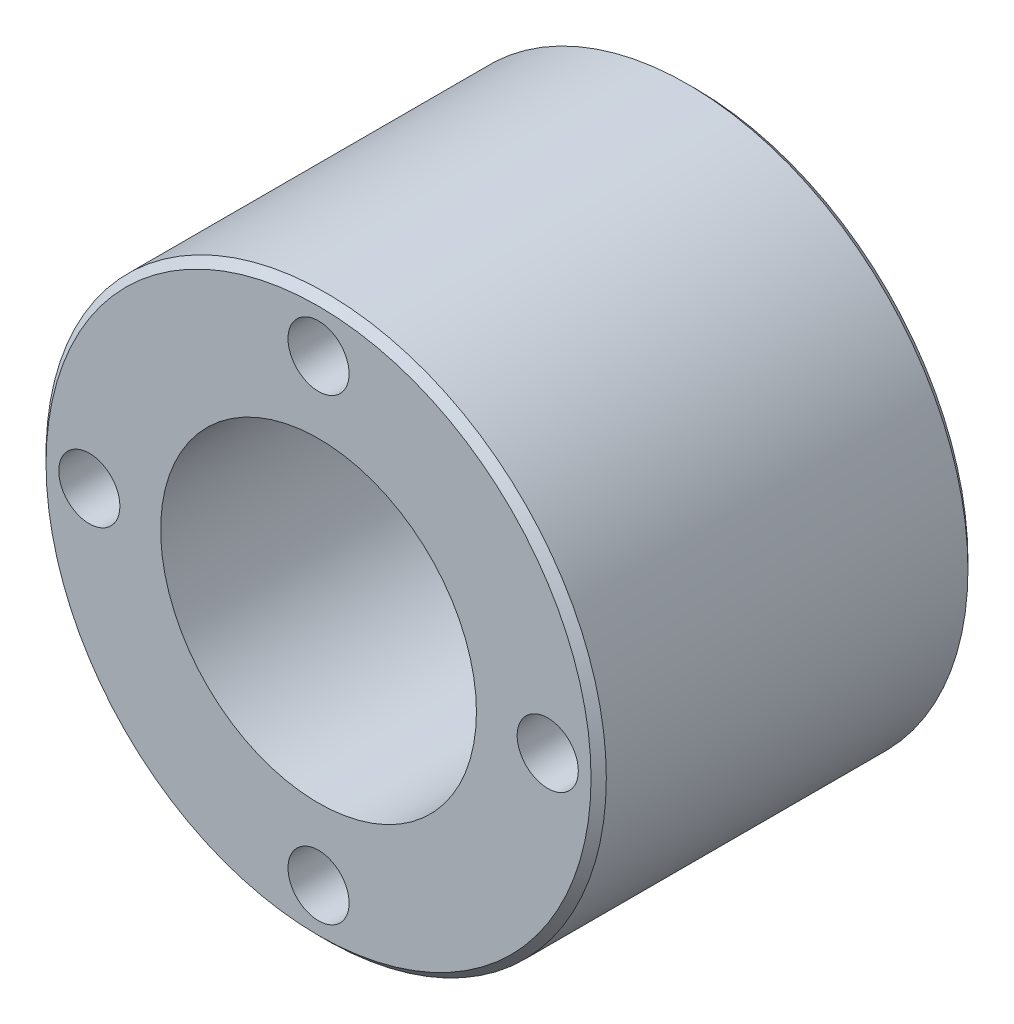
ISO-10303-21;
HEADER;
FILE_DESCRIPTION(('STEP AP214'),'2;1');
FILE_NAME('part.step','',(''),(''),'','','');
FILE_SCHEMA(('AUTOMOTIVE_DESIGN { 1 0 10303 214 1 1 1 1 }'));
ENDSEC;
DATA;
#1=APPLICATION_CONTEXT('core data for automotive mechanical design processes');
#2=APPLICATION_PROTOCOL_DEFINITION('international standard','automotive_design',2000,#1);
#3=PRODUCT_CONTEXT('',#1,'mechanical');
#4=PRODUCT('Part','Part','',(#3));
#5=PRODUCT_RELATED_PRODUCT_CATEGORY('part','',(#4));
#6=PRODUCT_DEFINITION_FORMATION('','',#4);
#7=PRODUCT_DEFINITION_CONTEXT('part definition',#1,'design');
#8=PRODUCT_DEFINITION('design','',#6,#7);
#9=PRODUCT_DEFINITION_SHAPE('','',#8);
#10=(LENGTH_UNIT() NAMED_UNIT(*) SI_UNIT(.MILLI.,.METRE.));
#11=(NAMED_UNIT(*) PLANE_ANGLE_UNIT() SI_UNIT($,.RADIAN.));
#12=(NAMED_UNIT(*) SI_UNIT($,.STERADIAN.) SOLID_ANGLE_UNIT());
#13=UNCERTAINTY_MEASURE_WITH_UNIT(LENGTH_MEASURE(1.E-05),#10,'distance_accuracy_value','');
#14=(GEOMETRIC_REPRESENTATION_CONTEXT(3) GLOBAL_UNCERTAINTY_ASSIGNED_CONTEXT((#13)) GLOBAL_UNIT_ASSIGNED_CONTEXT((#10,
#11,#12)) REPRESENTATION_CONTEXT('',''));
#15=CARTESIAN_POINT('',(0.,0.,0.));
#16=DIRECTION('',(0.,0.,1.));
#17=DIRECTION('',(1.,0.,0.));
#18=AXIS2_PLACEMENT_3D('',#15,#16,#17);
#19=CARTESIAN_POINT('',(0.,0.,14.8));
#20=DIRECTION('',(0.,0.,1.));
#21=DIRECTION('',(1.,0.,0.));
#22=AXIS2_PLACEMENT_3D('',#19,#20,#21);
#23=PLANE('',#22);
#24=CARTESIAN_POINT('',(0.,0.,14.8));
#25=DIRECTION('',(0.,0.,1.));
#26=DIRECTION('',(1.,0.,0.));
#27=AXIS2_PLACEMENT_3D('',#24,#25,#26);
#28=CIRCLE('',#27,10.7);
#29=CARTESIAN_POINT('',(10.7,0.,14.8));
#30=VERTEX_POINT('',#29);
#31=EDGE_CURVE('E10',#30,#30,#28,.T.);
#32=ORIENTED_EDGE('',*,*,#31,.T.);
#33=EDGE_LOOP('',(#32));
#34=FACE_BOUND('',#33,.T.);
#35=CARTESIAN_POINT('',(0.,9.,14.8));
#36=DIRECTION('',(0.,0.,1.));
#37=DIRECTION('',(1.,0.,0.));
#38=AXIS2_PLACEMENT_3D('',#35,#36,#37);
#39=CIRCLE('',#38,1.2);
#40=CARTESIAN_POINT('',(1.2,9.,14.8));
#41=VERTEX_POINT('',#40);
#42=EDGE_CURVE('E75',#41,#41,#39,.T.);
#43=ORIENTED_EDGE('',*,*,#42,.F.);
#44=EDGE_LOOP('',(#43));
#45=FACE_BOUND('',#44,.T.);
#46=CARTESIAN_POINT('',(9.00000000000025,2.54693202754403E-13,14.8));
#47=DIRECTION('',(0.,0.,1.));
#48=DIRECTION('',(1.,0.,0.));
#49=AXIS2_PLACEMENT_3D('',#46,#47,#48);
#50=CIRCLE('',#49,1.2000000000002);
#51=CARTESIAN_POINT('',(10.2000000000005,2.54693202754403E-13,14.8));
#52=VERTEX_POINT('',#51);
#53=EDGE_CURVE('E69',#52,#52,#50,.T.);
#54=ORIENTED_EDGE('',*,*,#53,.F.);
#55=EDGE_LOOP('',(#54));
#56=FACE_BOUND('',#55,.T.);
#57=CARTESIAN_POINT('',(5.09386405508807E-13,-9.,14.8));
#58=DIRECTION('',(0.,0.,1.));
#59=DIRECTION('',(1.,0.,0.));
#60=AXIS2_PLACEMENT_3D('',#57,#58,#59);
#61=CIRCLE('',#60,1.20000000000055);
#62=CARTESIAN_POINT('',(1.20000000000106,-9.,14.8));
#63=VERTEX_POINT('',#62);
#64=EDGE_CURVE('E63',#63,#63,#61,.T.);
#65=ORIENTED_EDGE('',*,*,#64,.F.);
#66=EDGE_LOOP('',(#65));
#67=FACE_BOUND('',#66,.T.);
#68=CARTESIAN_POINT('',(-8.99999999999974,-2.55795384873636E-13,14.8));
#69=DIRECTION('',(0.,0.,1.));
#70=DIRECTION('',(1.,0.,0.));
#71=AXIS2_PLACEMENT_3D('',#68,#69,#70);
#72=CIRCLE('',#71,1.20000000000041);
#73=CARTESIAN_POINT('',(-7.79999999999934,-2.55795384873636E-13,14.8));
#74=VERTEX_POINT('',#73);
#75=EDGE_CURVE('E57',#74,#74,#72,.T.);
#76=ORIENTED_EDGE('',*,*,#75,.F.);
#77=EDGE_LOOP('',(#76));
#78=FACE_BOUND('',#77,.T.);
#79=CARTESIAN_POINT('',(0.,0.,14.8));
#80=DIRECTION('',(0.,0.,1.));
#81=DIRECTION('',(1.,0.,0.));
#82=AXIS2_PLACEMENT_3D('',#79,#80,#81);
#83=CIRCLE('',#82,6.2);
#84=CARTESIAN_POINT('',(6.2,0.,14.8));
#85=VERTEX_POINT('',#84);
#86=EDGE_CURVE('E50',#85,#85,#83,.T.);
#87=ORIENTED_EDGE('',*,*,#86,.F.);
#88=EDGE_LOOP('',(#87));
#89=FACE_BOUND('',#88,.T.);
#90=ADVANCED_FACE('F30',(#34,#45,#56,#67,#78,#89),#23,.T.);
#91=CARTESIAN_POINT('',(0.,0.,0.));
#92=DIRECTION('',(0.,0.,1.));
#93=DIRECTION('',(1.,0.,0.));
#94=AXIS2_PLACEMENT_3D('',#91,#92,#93);
#95=PLANE('',#94);
#96=CARTESIAN_POINT('',(0.,0.,0.));
#97=DIRECTION('',(0.,0.,1.));
#98=DIRECTION('',(1.,0.,0.));
#99=AXIS2_PLACEMENT_3D('',#96,#97,#98);
#100=CIRCLE('',#99,10.7);
#101=CARTESIAN_POINT('',(10.7,0.,0.));
#102=VERTEX_POINT('',#101);
#103=EDGE_CURVE('E37',#102,#102,#100,.F.);
#104=ORIENTED_EDGE('',*,*,#103,.T.);
#105=EDGE_LOOP('',(#104));
#106=FACE_BOUND('',#105,.T.);
#107=CARTESIAN_POINT('',(0.,9.,0.));
#108=DIRECTION('',(0.,0.,1.));
#109=DIRECTION('',(1.,0.,0.));
#110=AXIS2_PLACEMENT_3D('',#107,#108,#109);
#111=CIRCLE('',#110,1.2);
#112=CARTESIAN_POINT('',(1.2,9.,0.));
#113=VERTEX_POINT('',#112);
#114=EDGE_CURVE('E54',#113,#113,#111,.T.);
#115=ORIENTED_EDGE('',*,*,#114,.T.);
#116=EDGE_LOOP('',(#115));
#117=FACE_BOUND('',#116,.T.);
#118=CARTESIAN_POINT('',(9.00000000000025,2.54693202754403E-13,0.));
#119=DIRECTION('',(0.,0.,1.));
#120=DIRECTION('',(1.,0.,0.));
#121=AXIS2_PLACEMENT_3D('',#118,#119,#120);
#122=CIRCLE('',#121,1.2000000000002);
#123=CARTESIAN_POINT('',(10.2000000000005,2.54693202754403E-13,0.));
#124=VERTEX_POINT('',#123);
#125=EDGE_CURVE('E72',#124,#124,#122,.T.);
#126=ORIENTED_EDGE('',*,*,#125,.T.);
#127=EDGE_LOOP('',(#126));
#128=FACE_BOUND('',#127,.T.);
#129=CARTESIAN_POINT('',(5.09386405508807E-13,-9.,0.));
#130=DIRECTION('',(0.,0.,1.));
#131=DIRECTION('',(1.,0.,0.));
#132=AXIS2_PLACEMENT_3D('',#129,#130,#131);
#133=CIRCLE('',#132,1.20000000000055);
#134=CARTESIAN_POINT('',(1.20000000000106,-9.,0.));
#135=VERTEX_POINT('',#134);
#136=EDGE_CURVE('E66',#135,#135,#133,.T.);
#137=ORIENTED_EDGE('',*,*,#136,.T.);
#138=EDGE_LOOP('',(#137));
#139=FACE_BOUND('',#138,.T.);
#140=CARTESIAN_POINT('',(-8.99999999999974,-2.55795384873636E-13,0.));
#141=DIRECTION('',(0.,0.,1.));
#142=DIRECTION('',(1.,0.,0.));
#143=AXIS2_PLACEMENT_3D('',#140,#141,#142);
#144=CIRCLE('',#143,1.20000000000041);
#145=CARTESIAN_POINT('',(-7.79999999999934,-2.55795384873636E-13,0.));
#146=VERTEX_POINT('',#145);
#147=EDGE_CURVE('E60',#146,#146,#144,.T.);
#148=ORIENTED_EDGE('',*,*,#147,.T.);
#149=EDGE_LOOP('',(#148));
#150=FACE_BOUND('',#149,.T.);
#151=CARTESIAN_POINT('',(0.,0.,0.));
#152=DIRECTION('',(0.,0.,1.));
#153=DIRECTION('',(1.,0.,0.));
#154=AXIS2_PLACEMENT_3D('',#151,#152,#153);
#155=CIRCLE('',#154,6.2);
#156=CARTESIAN_POINT('',(6.2,0.,0.));
#157=VERTEX_POINT('',#156);
#158=EDGE_CURVE('E51',#157,#157,#155,.T.);
#159=ORIENTED_EDGE('',*,*,#158,.T.);
#160=EDGE_LOOP('',(#159));
#161=FACE_BOUND('',#160,.T.);
#162=ADVANCED_FACE('F81',(#106,#117,#128,#139,#150,#161),#95,.F.);
#163=CARTESIAN_POINT('',(0.,0.,14.8));
#164=DIRECTION('',(0.,0.,-1.));
#165=DIRECTION('',(-1.,0.,0.));
#166=AXIS2_PLACEMENT_3D('',#163,#164,#165);
#167=CYLINDRICAL_SURFACE('',#166,11.);
#168=CARTESIAN_POINT('',(0.,0.,0.300000000000003));
#169=DIRECTION('',(0.,0.,1.));
#170=DIRECTION('',(1.,0.,0.));
#171=AXIS2_PLACEMENT_3D('',#168,#169,#170);
#172=CIRCLE('',#171,11.);
#173=CARTESIAN_POINT('',(11.,0.,0.300000000000003));
#174=VERTEX_POINT('',#173);
#175=EDGE_CURVE('E41',#174,#174,#172,.T.);
#176=ORIENTED_EDGE('',*,*,#175,.T.);
#177=EDGE_LOOP('',(#176));
#178=FACE_BOUND('',#177,.T.);
#179=CARTESIAN_POINT('',(0.,0.,14.5));
#180=DIRECTION('',(0.,0.,1.));
#181=DIRECTION('',(1.,0.,0.));
#182=AXIS2_PLACEMENT_3D('',#179,#180,#181);
#183=CIRCLE('',#182,11.);
#184=CARTESIAN_POINT('',(11.,0.,14.5));
#185=VERTEX_POINT('',#184);
#186=EDGE_CURVE('E45',#185,#185,#183,.F.);
#187=ORIENTED_EDGE('',*,*,#186,.T.);
#188=EDGE_LOOP('',(#187));
#189=FACE_BOUND('',#188,.T.);
#190=ADVANCED_FACE('F107',(#178,#189),#167,.T.);
#191=CARTESIAN_POINT('',(0.,0.,14.8));
#192=DIRECTION('',(0.,0.,-1.));
#193=DIRECTION('',(-1.,0.,0.));
#194=AXIS2_PLACEMENT_3D('',#191,#192,#193);
#195=CYLINDRICAL_SURFACE('',#194,6.2);
#196=ORIENTED_EDGE('',*,*,#86,.T.);
#197=EDGE_LOOP('',(#196));
#198=FACE_BOUND('',#197,.T.);
#199=ORIENTED_EDGE('',*,*,#158,.F.);
#200=EDGE_LOOP('',(#199));
#201=FACE_BOUND('',#200,.T.);
#202=ADVANCED_FACE('F103',(#198,#201),#195,.F.);
#203=CARTESIAN_POINT('',(-8.99999999999974,-2.55795384873636E-13,0.));
#204=DIRECTION('',(0.,0.,1.));
#205=DIRECTION('',(1.,0.,0.));
#206=AXIS2_PLACEMENT_3D('',#203,#204,#205);
#207=CYLINDRICAL_SURFACE('',#206,1.20000000000041);
#208=ORIENTED_EDGE('',*,*,#147,.F.);
#209=EDGE_LOOP('',(#208));
#210=FACE_BOUND('',#209,.T.);
#211=ORIENTED_EDGE('',*,*,#75,.T.);
#212=EDGE_LOOP('',(#211));
#213=FACE_BOUND('',#212,.T.);
#214=ADVANCED_FACE('F106',(#210,#213),#207,.F.);
#215=CARTESIAN_POINT('',(5.09386405508807E-13,-9.,0.));
#216=DIRECTION('',(0.,0.,1.));
#217=DIRECTION('',(1.,0.,0.));
#218=AXIS2_PLACEMENT_3D('',#215,#216,#217);
#219=CYLINDRICAL_SURFACE('',#218,1.20000000000055);
#220=ORIENTED_EDGE('',*,*,#136,.F.);
#221=EDGE_LOOP('',(#220));
#222=FACE_BOUND('',#221,.T.);
#223=ORIENTED_EDGE('',*,*,#64,.T.);
#224=EDGE_LOOP('',(#223));
#225=FACE_BOUND('',#224,.T.);
#226=ADVANCED_FACE('F167',(#222,#225),#219,.F.);
#227=CARTESIAN_POINT('',(9.00000000000025,2.54693202754403E-13,0.));
#228=DIRECTION('',(0.,0.,1.));
#229=DIRECTION('',(1.,0.,0.));
#230=AXIS2_PLACEMENT_3D('',#227,#228,#229);
#231=CYLINDRICAL_SURFACE('',#230,1.2000000000002);
#232=ORIENTED_EDGE('',*,*,#125,.F.);
#233=EDGE_LOOP('',(#232));
#234=FACE_BOUND('',#233,.T.);
#235=ORIENTED_EDGE('',*,*,#53,.T.);
#236=EDGE_LOOP('',(#235));
#237=FACE_BOUND('',#236,.T.);
#238=ADVANCED_FACE('F88',(#234,#237),#231,.F.);
#239=CARTESIAN_POINT('',(0.,9.,0.));
#240=DIRECTION('',(0.,0.,1.));
#241=DIRECTION('',(1.,0.,0.));
#242=AXIS2_PLACEMENT_3D('',#239,#240,#241);
#243=CYLINDRICAL_SURFACE('',#242,1.2);
#244=ORIENTED_EDGE('',*,*,#114,.F.);
#245=EDGE_LOOP('',(#244));
#246=FACE_BOUND('',#245,.T.);
#247=ORIENTED_EDGE('',*,*,#42,.T.);
#248=EDGE_LOOP('',(#247));
#249=FACE_BOUND('',#248,.T.);
#250=ADVANCED_FACE('F84',(#246,#249),#243,.F.);
#251=CARTESIAN_POINT('',(0.,0.,0.300000000000003));
#252=DIRECTION('',(0.,0.,1.));
#253=DIRECTION('',(1.,0.,0.));
#254=AXIS2_PLACEMENT_3D('',#251,#252,#253);
#255=CONICAL_SURFACE('',#254,11.,0.785398163397445);
#256=ORIENTED_EDGE('',*,*,#103,.F.);
#257=EDGE_LOOP('',(#256));
#258=FACE_BOUND('',#257,.T.);
#259=ORIENTED_EDGE('',*,*,#175,.F.);
#260=EDGE_LOOP('',(#259));
#261=FACE_BOUND('',#260,.T.);
#262=ADVANCED_FACE('F87',(#258,#261),#255,.T.);
#263=CARTESIAN_POINT('',(0.,0.,14.8));
#264=DIRECTION('',(0.,0.,-1.));
#265=DIRECTION('',(-1.,0.,0.));
#266=AXIS2_PLACEMENT_3D('',#263,#264,#265);
#267=CONICAL_SURFACE('',#266,10.7,0.785398163397434);
#268=ORIENTED_EDGE('',*,*,#186,.F.);
#269=EDGE_LOOP('',(#268));
#270=FACE_BOUND('',#269,.T.);
#271=ORIENTED_EDGE('',*,*,#31,.F.);
#272=EDGE_LOOP('',(#271));
#273=FACE_BOUND('',#272,.T.);
#274=ADVANCED_FACE('F32',(#270,#273),#267,.T.);
#275=CLOSED_SHELL('',(#90,#162,#190,#202,#214,#226,#238,#250,#262,#274));
#276=MANIFOLD_SOLID_BREP('B2',#275);
#277=ADVANCED_BREP_SHAPE_REPRESENTATION('',(#18,#276),#14);
#278=SHAPE_DEFINITION_REPRESENTATION(#9,#277);
ENDSEC;
END-ISO-10303-21;
